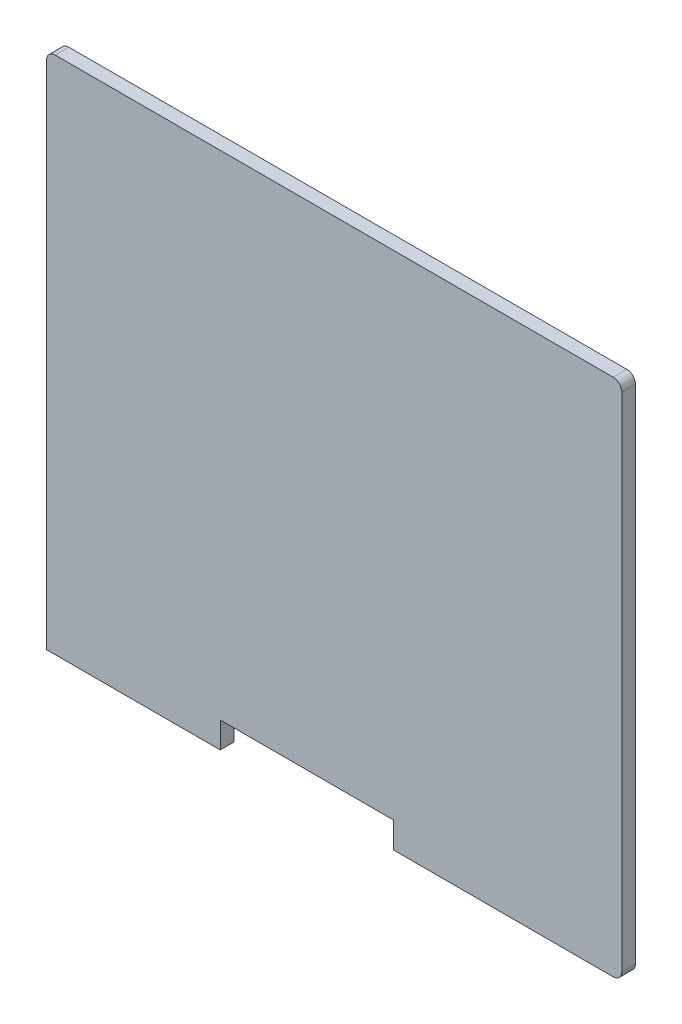
ISO-10303-21;
HEADER;
FILE_DESCRIPTION(('STEP AP214'),'2;1');
FILE_NAME('part.step','',(''),(''),'','','');
FILE_SCHEMA(('AUTOMOTIVE_DESIGN { 1 0 10303 214 1 1 1 1 }'));
ENDSEC;
DATA;
#1=APPLICATION_CONTEXT('core data for automotive mechanical design processes');
#2=APPLICATION_PROTOCOL_DEFINITION('international standard','automotive_design',2000,#1);
#3=PRODUCT_CONTEXT('',#1,'mechanical');
#4=PRODUCT('Part','Part','',(#3));
#5=PRODUCT_RELATED_PRODUCT_CATEGORY('part','',(#4));
#6=PRODUCT_DEFINITION_FORMATION('','',#4);
#7=PRODUCT_DEFINITION_CONTEXT('part definition',#1,'design');
#8=PRODUCT_DEFINITION('design','',#6,#7);
#9=PRODUCT_DEFINITION_SHAPE('','',#8);
#10=(LENGTH_UNIT() NAMED_UNIT(*) SI_UNIT(.MILLI.,.METRE.));
#11=(NAMED_UNIT(*) PLANE_ANGLE_UNIT() SI_UNIT($,.RADIAN.));
#12=(NAMED_UNIT(*) SI_UNIT($,.STERADIAN.) SOLID_ANGLE_UNIT());
#13=UNCERTAINTY_MEASURE_WITH_UNIT(LENGTH_MEASURE(1.E-05),#10,'distance_accuracy_value','');
#14=(GEOMETRIC_REPRESENTATION_CONTEXT(3) GLOBAL_UNCERTAINTY_ASSIGNED_CONTEXT((#13)) GLOBAL_UNIT_ASSIGNED_CONTEXT((#10,
#11,#12)) REPRESENTATION_CONTEXT('',''));
#15=CARTESIAN_POINT('',(0.,0.,0.));
#16=DIRECTION('',(0.,0.,1.));
#17=DIRECTION('',(1.,0.,0.));
#18=AXIS2_PLACEMENT_3D('',#15,#16,#17);
#19=CARTESIAN_POINT('',(55.5709843246072,7.31756397931187,-1.5748));
#20=DIRECTION('',(0.,-1.,0.));
#21=DIRECTION('',(1.,0.,0.));
#22=AXIS2_PLACEMENT_3D('',#19,#20,#21);
#23=PLANE('',#22);
#24=DIRECTION('',(1.,0.,0.));
#25=VECTOR('',#24,1.);
#26=CARTESIAN_POINT('',(55.5709843246072,7.31756397931187,0.));
#27=LINE('',#26,#25);
#28=CARTESIAN_POINT('',(55.5709843246072,7.31756397931187,0.));
#29=VERTEX_POINT('',#28);
#30=CARTESIAN_POINT('',(75.6429843246072,7.31756397931187,0.));
#31=VERTEX_POINT('',#30);
#32=EDGE_CURVE('E148',#29,#31,#27,.T.);
#33=ORIENTED_EDGE('',*,*,#32,.F.);
#34=DIRECTION('',(0.,0.,1.));
#35=VECTOR('',#34,1.);
#36=CARTESIAN_POINT('',(55.5709843246072,7.31756397931187,-1.5748));
#37=LINE('',#36,#35);
#38=CARTESIAN_POINT('',(55.5709843246072,7.31756397931187,-1.5748));
#39=VERTEX_POINT('',#38);
#40=EDGE_CURVE('E11',#39,#29,#37,.T.);
#41=ORIENTED_EDGE('',*,*,#40,.F.);
#42=DIRECTION('',(1.,0.,0.));
#43=VECTOR('',#42,1.);
#44=CARTESIAN_POINT('',(55.5709843246072,7.31756397931187,-1.5748));
#45=LINE('',#44,#43);
#46=CARTESIAN_POINT('',(75.6429843246072,7.31756397931187,-1.5748));
#47=VERTEX_POINT('',#46);
#48=EDGE_CURVE('E177',#39,#47,#45,.T.);
#49=ORIENTED_EDGE('',*,*,#48,.T.);
#50=DIRECTION('',(0.,0.,1.));
#51=VECTOR('',#50,1.);
#52=CARTESIAN_POINT('',(75.6429843246072,7.31756397931187,-1.5748));
#53=LINE('',#52,#51);
#54=EDGE_CURVE('E36',#47,#31,#53,.T.);
#55=ORIENTED_EDGE('',*,*,#54,.T.);
#56=EDGE_LOOP('',(#33,#41,#49,#55));
#57=FACE_BOUND('',#56,.T.);
#58=ADVANCED_FACE('F33',(#57),#23,.T.);
#59=CARTESIAN_POINT('',(55.5709843246072,66.3175639793119,-1.5748));
#60=DIRECTION('',(-1.,0.,0.));
#61=DIRECTION('',(0.,-1.,0.));
#62=AXIS2_PLACEMENT_3D('',#59,#60,#61);
#63=PLANE('',#62);
#64=DIRECTION('',(0.,-1.,0.));
#65=VECTOR('',#64,1.);
#66=CARTESIAN_POINT('',(55.5709843246072,66.3175639793119,0.));
#67=LINE('',#66,#65);
#68=CARTESIAN_POINT('',(55.5709843246072,66.3175639793119,0.));
#69=VERTEX_POINT('',#68);
#70=EDGE_CURVE('E175',#69,#29,#67,.T.);
#71=ORIENTED_EDGE('',*,*,#70,.F.);
#72=DIRECTION('',(0.,0.,1.));
#73=VECTOR('',#72,1.);
#74=CARTESIAN_POINT('',(55.5709843246072,66.3175639793119,-1.5748));
#75=LINE('',#74,#73);
#76=CARTESIAN_POINT('',(55.5709843246072,66.3175639793119,-1.5748));
#77=VERTEX_POINT('',#76);
#78=EDGE_CURVE('E42',#77,#69,#75,.T.);
#79=ORIENTED_EDGE('',*,*,#78,.F.);
#80=DIRECTION('',(0.,-1.,0.));
#81=VECTOR('',#80,1.);
#82=CARTESIAN_POINT('',(55.5709843246072,66.3175639793119,-1.5748));
#83=LINE('',#82,#81);
#84=EDGE_CURVE('E138',#77,#39,#83,.T.);
#85=ORIENTED_EDGE('',*,*,#84,.T.);
#86=ORIENTED_EDGE('',*,*,#40,.T.);
#87=EDGE_LOOP('',(#71,#79,#85,#86));
#88=FACE_BOUND('',#87,.T.);
#89=ADVANCED_FACE('F195',(#88),#63,.T.);
#90=CARTESIAN_POINT('',(56.5709843246072,66.3175639793119,-1.5748));
#91=DIRECTION('',(0.,0.,1.));
#92=DIRECTION('',(1.,0.,0.));
#93=AXIS2_PLACEMENT_3D('',#90,#91,#92);
#94=CYLINDRICAL_SURFACE('',#93,1.);
#95=CARTESIAN_POINT('',(56.5709843246072,66.3175639793119,0.));
#96=DIRECTION('',(0.,0.,1.));
#97=DIRECTION('',(1.,0.,0.));
#98=AXIS2_PLACEMENT_3D('',#95,#96,#97);
#99=CIRCLE('',#98,1.);
#100=CARTESIAN_POINT('',(56.5709843246072,67.3175639793119,0.));
#101=VERTEX_POINT('',#100);
#102=EDGE_CURVE('E125',#101,#69,#99,.T.);
#103=ORIENTED_EDGE('',*,*,#102,.F.);
#104=DIRECTION('',(0.,0.,1.));
#105=VECTOR('',#104,1.);
#106=CARTESIAN_POINT('',(56.5709843246072,67.3175639793119,-1.5748));
#107=LINE('',#106,#105);
#108=CARTESIAN_POINT('',(56.5709843246072,67.3175639793119,-1.5748));
#109=VERTEX_POINT('',#108);
#110=EDGE_CURVE('E120',#109,#101,#107,.T.);
#111=ORIENTED_EDGE('',*,*,#110,.F.);
#112=CARTESIAN_POINT('',(56.5709843246072,66.3175639793119,-1.5748));
#113=DIRECTION('',(0.,0.,1.));
#114=DIRECTION('',(1.,0.,0.));
#115=AXIS2_PLACEMENT_3D('',#112,#113,#114);
#116=CIRCLE('',#115,1.);
#117=EDGE_CURVE('E123',#109,#77,#116,.T.);
#118=ORIENTED_EDGE('',*,*,#117,.T.);
#119=ORIENTED_EDGE('',*,*,#78,.T.);
#120=EDGE_LOOP('',(#103,#111,#118,#119));
#121=FACE_BOUND('',#120,.T.);
#122=ADVANCED_FACE('F122',(#121),#94,.T.);
#123=CARTESIAN_POINT('',(56.5709843246072,67.3175639793119,-1.5748));
#124=DIRECTION('',(0.,1.,0.));
#125=DIRECTION('',(-1.,0.,0.));
#126=AXIS2_PLACEMENT_3D('',#123,#124,#125);
#127=PLANE('',#126);
#128=DIRECTION('',(-1.,0.,0.));
#129=VECTOR('',#128,1.);
#130=CARTESIAN_POINT('',(56.5709843246072,67.3175639793119,0.));
#131=LINE('',#130,#129);
#132=CARTESIAN_POINT('',(121.040984324607,67.3175639793119,0.));
#133=VERTEX_POINT('',#132);
#134=EDGE_CURVE('E172',#133,#101,#131,.T.);
#135=ORIENTED_EDGE('',*,*,#134,.F.);
#136=DIRECTION('',(0.,0.,1.));
#137=VECTOR('',#136,1.);
#138=CARTESIAN_POINT('',(121.040984324607,67.3175639793119,-1.5748));
#139=LINE('',#138,#137);
#140=CARTESIAN_POINT('',(121.040984324607,67.3175639793119,-1.5748));
#141=VERTEX_POINT('',#140);
#142=EDGE_CURVE('E130',#141,#133,#139,.T.);
#143=ORIENTED_EDGE('',*,*,#142,.F.);
#144=DIRECTION('',(-1.,0.,0.));
#145=VECTOR('',#144,1.);
#146=CARTESIAN_POINT('',(56.5709843246072,67.3175639793119,-1.5748));
#147=LINE('',#146,#145);
#148=EDGE_CURVE('E136',#141,#109,#147,.T.);
#149=ORIENTED_EDGE('',*,*,#148,.T.);
#150=ORIENTED_EDGE('',*,*,#110,.T.);
#151=EDGE_LOOP('',(#135,#143,#149,#150));
#152=FACE_BOUND('',#151,.T.);
#153=ADVANCED_FACE('F140',(#152),#127,.T.);
#154=CARTESIAN_POINT('',(121.040984324607,66.3175639793119,-1.5748));
#155=DIRECTION('',(0.,0.,1.));
#156=DIRECTION('',(1.,0.,0.));
#157=AXIS2_PLACEMENT_3D('',#154,#155,#156);
#158=CYLINDRICAL_SURFACE('',#157,1.);
#159=CARTESIAN_POINT('',(121.040984324607,66.3175639793119,0.));
#160=DIRECTION('',(0.,0.,1.));
#161=DIRECTION('',(-1.,0.,0.));
#162=AXIS2_PLACEMENT_3D('',#159,#160,#161);
#163=CIRCLE('',#162,1.);
#164=CARTESIAN_POINT('',(122.040984324607,66.3175639793119,0.));
#165=VERTEX_POINT('',#164);
#166=EDGE_CURVE('E169',#165,#133,#163,.T.);
#167=ORIENTED_EDGE('',*,*,#166,.F.);
#168=DIRECTION('',(0.,0.,1.));
#169=VECTOR('',#168,1.);
#170=CARTESIAN_POINT('',(122.040984324607,66.3175639793119,-1.5748));
#171=LINE('',#170,#169);
#172=CARTESIAN_POINT('',(122.040984324607,66.3175639793119,-1.5748));
#173=VERTEX_POINT('',#172);
#174=EDGE_CURVE('E181',#173,#165,#171,.T.);
#175=ORIENTED_EDGE('',*,*,#174,.F.);
#176=CARTESIAN_POINT('',(121.040984324607,66.3175639793119,-1.5748));
#177=DIRECTION('',(0.,0.,1.));
#178=DIRECTION('',(-1.,0.,0.));
#179=AXIS2_PLACEMENT_3D('',#176,#177,#178);
#180=CIRCLE('',#179,1.);
#181=EDGE_CURVE('E141',#173,#141,#180,.T.);
#182=ORIENTED_EDGE('',*,*,#181,.T.);
#183=ORIENTED_EDGE('',*,*,#142,.T.);
#184=EDGE_LOOP('',(#167,#175,#182,#183));
#185=FACE_BOUND('',#184,.T.);
#186=ADVANCED_FACE('F208',(#185),#158,.T.);
#187=CARTESIAN_POINT('',(122.040984324607,66.3175639793119,-1.5748));
#188=DIRECTION('',(1.,0.,0.));
#189=DIRECTION('',(0.,1.,0.));
#190=AXIS2_PLACEMENT_3D('',#187,#188,#189);
#191=PLANE('',#190);
#192=DIRECTION('',(0.,1.,0.));
#193=VECTOR('',#192,1.);
#194=CARTESIAN_POINT('',(122.040984324607,66.3175639793119,0.));
#195=LINE('',#194,#193);
#196=CARTESIAN_POINT('',(122.040984324607,8.31756397931187,0.));
#197=VERTEX_POINT('',#196);
#198=EDGE_CURVE('E166',#197,#165,#195,.T.);
#199=ORIENTED_EDGE('',*,*,#198,.F.);
#200=DIRECTION('',(0.,0.,1.));
#201=VECTOR('',#200,1.);
#202=CARTESIAN_POINT('',(122.040984324607,8.31756397931187,-1.5748));
#203=LINE('',#202,#201);
#204=CARTESIAN_POINT('',(122.040984324607,8.31756397931187,-1.5748));
#205=VERTEX_POINT('',#204);
#206=EDGE_CURVE('E183',#205,#197,#203,.T.);
#207=ORIENTED_EDGE('',*,*,#206,.F.);
#208=DIRECTION('',(0.,1.,0.));
#209=VECTOR('',#208,1.);
#210=CARTESIAN_POINT('',(122.040984324607,66.3175639793119,-1.5748));
#211=LINE('',#210,#209);
#212=EDGE_CURVE('E143',#205,#173,#211,.T.);
#213=ORIENTED_EDGE('',*,*,#212,.T.);
#214=ORIENTED_EDGE('',*,*,#174,.T.);
#215=EDGE_LOOP('',(#199,#207,#213,#214));
#216=FACE_BOUND('',#215,.T.);
#217=ADVANCED_FACE('F211',(#216),#191,.T.);
#218=CARTESIAN_POINT('',(121.040984324607,8.31756397931187,-1.5748));
#219=DIRECTION('',(0.,0.,1.));
#220=DIRECTION('',(1.,0.,0.));
#221=AXIS2_PLACEMENT_3D('',#218,#219,#220);
#222=CYLINDRICAL_SURFACE('',#221,1.00000000000001);
#223=CARTESIAN_POINT('',(121.040984324607,8.31756397931187,0.));
#224=DIRECTION('',(0.,0.,1.));
#225=DIRECTION('',(1.,0.,0.));
#226=AXIS2_PLACEMENT_3D('',#223,#224,#225);
#227=CIRCLE('',#226,1.00000000000001);
#228=CARTESIAN_POINT('',(121.040984324607,7.31756397931187,0.));
#229=VERTEX_POINT('',#228);
#230=EDGE_CURVE('E163',#229,#197,#227,.T.);
#231=ORIENTED_EDGE('',*,*,#230,.F.);
#232=DIRECTION('',(0.,0.,1.));
#233=VECTOR('',#232,1.);
#234=CARTESIAN_POINT('',(121.040984324607,7.31756397931187,-1.5748));
#235=LINE('',#234,#233);
#236=CARTESIAN_POINT('',(121.040984324607,7.31756397931187,-1.5748));
#237=VERTEX_POINT('',#236);
#238=EDGE_CURVE('E185',#237,#229,#235,.T.);
#239=ORIENTED_EDGE('',*,*,#238,.F.);
#240=CARTESIAN_POINT('',(121.040984324607,8.31756397931187,-1.5748));
#241=DIRECTION('',(0.,0.,1.));
#242=DIRECTION('',(1.,0.,0.));
#243=AXIS2_PLACEMENT_3D('',#240,#241,#242);
#244=CIRCLE('',#243,1.00000000000001);
#245=EDGE_CURVE('E327',#237,#205,#244,.T.);
#246=ORIENTED_EDGE('',*,*,#245,.T.);
#247=ORIENTED_EDGE('',*,*,#206,.T.);
#248=EDGE_LOOP('',(#231,#239,#246,#247));
#249=FACE_BOUND('',#248,.T.);
#250=ADVANCED_FACE('F215',(#249),#222,.T.);
#251=CARTESIAN_POINT('',(95.6429843246072,7.31756397931187,-1.5748));
#252=DIRECTION('',(0.,-1.,0.));
#253=DIRECTION('',(0.,0.,-1.));
#254=AXIS2_PLACEMENT_3D('',#251,#252,#253);
#255=PLANE('',#254);
#256=DIRECTION('',(1.,0.,0.));
#257=VECTOR('',#256,1.);
#258=CARTESIAN_POINT('',(95.6429843246072,7.31756397931187,0.));
#259=LINE('',#258,#257);
#260=CARTESIAN_POINT('',(95.6429843246072,7.31756397931187,0.));
#261=VERTEX_POINT('',#260);
#262=EDGE_CURVE('E160',#261,#229,#259,.T.);
#263=ORIENTED_EDGE('',*,*,#262,.F.);
#264=DIRECTION('',(0.,0.,1.));
#265=VECTOR('',#264,1.);
#266=CARTESIAN_POINT('',(95.6429843246072,7.31756397931187,-1.5748));
#267=LINE('',#266,#265);
#268=CARTESIAN_POINT('',(95.6429843246072,7.31756397931187,-1.5748));
#269=VERTEX_POINT('',#268);
#270=EDGE_CURVE('E187',#269,#261,#267,.T.);
#271=ORIENTED_EDGE('',*,*,#270,.F.);
#272=DIRECTION('',(1.,0.,0.));
#273=VECTOR('',#272,1.);
#274=CARTESIAN_POINT('',(95.6429843246072,7.31756397931187,-1.5748));
#275=LINE('',#274,#273);
#276=EDGE_CURVE('E320',#269,#237,#275,.T.);
#277=ORIENTED_EDGE('',*,*,#276,.T.);
#278=ORIENTED_EDGE('',*,*,#238,.T.);
#279=EDGE_LOOP('',(#263,#271,#277,#278));
#280=FACE_BOUND('',#279,.T.);
#281=ADVANCED_FACE('F219',(#280),#255,.T.);
#282=CARTESIAN_POINT('',(95.6429843246072,10.3175639793119,-1.5748));
#283=DIRECTION('',(-1.,0.,0.));
#284=DIRECTION('',(0.,0.,1.));
#285=AXIS2_PLACEMENT_3D('',#282,#283,#284);
#286=PLANE('',#285);
#287=DIRECTION('',(0.,-1.,0.));
#288=VECTOR('',#287,1.);
#289=CARTESIAN_POINT('',(95.6429843246072,10.3175639793119,0.));
#290=LINE('',#289,#288);
#291=CARTESIAN_POINT('',(95.6429843246072,10.3175639793119,0.));
#292=VERTEX_POINT('',#291);
#293=EDGE_CURVE('E157',#292,#261,#290,.T.);
#294=ORIENTED_EDGE('',*,*,#293,.F.);
#295=DIRECTION('',(0.,0.,1.));
#296=VECTOR('',#295,1.);
#297=CARTESIAN_POINT('',(95.6429843246072,10.3175639793119,-1.5748));
#298=LINE('',#297,#296);
#299=CARTESIAN_POINT('',(95.6429843246072,10.3175639793119,-1.5748));
#300=VERTEX_POINT('',#299);
#301=EDGE_CURVE('E189',#300,#292,#298,.T.);
#302=ORIENTED_EDGE('',*,*,#301,.F.);
#303=DIRECTION('',(0.,-1.,0.));
#304=VECTOR('',#303,1.);
#305=CARTESIAN_POINT('',(95.6429843246072,10.3175639793119,-1.5748));
#306=LINE('',#305,#304);
#307=EDGE_CURVE('E316',#300,#269,#306,.T.);
#308=ORIENTED_EDGE('',*,*,#307,.T.);
#309=ORIENTED_EDGE('',*,*,#270,.T.);
#310=EDGE_LOOP('',(#294,#302,#308,#309));
#311=FACE_BOUND('',#310,.T.);
#312=ADVANCED_FACE('F223',(#311),#286,.T.);
#313=CARTESIAN_POINT('',(75.6429843246072,10.3175639793119,-1.5748));
#314=DIRECTION('',(0.,-1.,0.));
#315=DIRECTION('',(0.,0.,-1.));
#316=AXIS2_PLACEMENT_3D('',#313,#314,#315);
#317=PLANE('',#316);
#318=DIRECTION('',(1.,0.,0.));
#319=VECTOR('',#318,1.);
#320=CARTESIAN_POINT('',(75.6429843246072,10.3175639793119,0.));
#321=LINE('',#320,#319);
#322=CARTESIAN_POINT('',(75.6429843246072,10.3175639793119,0.));
#323=VERTEX_POINT('',#322);
#324=EDGE_CURVE('E154',#323,#292,#321,.T.);
#325=ORIENTED_EDGE('',*,*,#324,.F.);
#326=DIRECTION('',(0.,0.,1.));
#327=VECTOR('',#326,1.);
#328=CARTESIAN_POINT('',(75.6429843246072,10.3175639793119,-1.5748));
#329=LINE('',#328,#327);
#330=CARTESIAN_POINT('',(75.6429843246072,10.3175639793119,-1.5748));
#331=VERTEX_POINT('',#330);
#332=EDGE_CURVE('E190',#331,#323,#329,.T.);
#333=ORIENTED_EDGE('',*,*,#332,.F.);
#334=DIRECTION('',(1.,0.,0.));
#335=VECTOR('',#334,1.);
#336=CARTESIAN_POINT('',(75.6429843246072,10.3175639793119,-1.5748));
#337=LINE('',#336,#335);
#338=EDGE_CURVE('E332',#331,#300,#337,.T.);
#339=ORIENTED_EDGE('',*,*,#338,.T.);
#340=ORIENTED_EDGE('',*,*,#301,.T.);
#341=EDGE_LOOP('',(#325,#333,#339,#340));
#342=FACE_BOUND('',#341,.T.);
#343=ADVANCED_FACE('F227',(#342),#317,.T.);
#344=CARTESIAN_POINT('',(75.6429843246072,7.31756397931187,-1.5748));
#345=DIRECTION('',(1.,0.,0.));
#346=DIRECTION('',(0.,0.,-1.));
#347=AXIS2_PLACEMENT_3D('',#344,#345,#346);
#348=PLANE('',#347);
#349=DIRECTION('',(0.,1.,0.));
#350=VECTOR('',#349,1.);
#351=CARTESIAN_POINT('',(75.6429843246072,7.31756397931187,0.));
#352=LINE('',#351,#350);
#353=EDGE_CURVE('E151',#31,#323,#352,.T.);
#354=ORIENTED_EDGE('',*,*,#353,.F.);
#355=ORIENTED_EDGE('',*,*,#54,.F.);
#356=DIRECTION('',(0.,1.,0.));
#357=VECTOR('',#356,1.);
#358=CARTESIAN_POINT('',(75.6429843246072,7.31756397931187,-1.5748));
#359=LINE('',#358,#357);
#360=EDGE_CURVE('E334',#47,#331,#359,.T.);
#361=ORIENTED_EDGE('',*,*,#360,.T.);
#362=ORIENTED_EDGE('',*,*,#332,.T.);
#363=EDGE_LOOP('',(#354,#355,#361,#362));
#364=FACE_BOUND('',#363,.T.);
#365=ADVANCED_FACE('F192',(#364),#348,.T.);
#366=CARTESIAN_POINT('',(121.040984324607,8.31756397931187,-1.5748));
#367=DIRECTION('',(0.,0.,1.));
#368=DIRECTION('',(1.,0.,0.));
#369=AXIS2_PLACEMENT_3D('',#366,#367,#368);
#370=PLANE('',#369);
#371=ORIENTED_EDGE('',*,*,#48,.F.);
#372=ORIENTED_EDGE('',*,*,#84,.F.);
#373=ORIENTED_EDGE('',*,*,#117,.F.);
#374=ORIENTED_EDGE('',*,*,#148,.F.);
#375=ORIENTED_EDGE('',*,*,#181,.F.);
#376=ORIENTED_EDGE('',*,*,#212,.F.);
#377=ORIENTED_EDGE('',*,*,#245,.F.);
#378=ORIENTED_EDGE('',*,*,#276,.F.);
#379=ORIENTED_EDGE('',*,*,#307,.F.);
#380=ORIENTED_EDGE('',*,*,#338,.F.);
#381=ORIENTED_EDGE('',*,*,#360,.F.);
#382=EDGE_LOOP('',(#371,#372,#373,#374,#375,#376,#377,#378,#379,#380,#381));
#383=FACE_BOUND('',#382,.T.);
#384=ADVANCED_FACE('F134',(#383),#370,.F.);
#385=CARTESIAN_POINT('',(121.040984324607,8.31756397931187,0.));
#386=DIRECTION('',(0.,0.,1.));
#387=DIRECTION('',(1.,0.,0.));
#388=AXIS2_PLACEMENT_3D('',#385,#386,#387);
#389=PLANE('',#388);
#390=ORIENTED_EDGE('',*,*,#32,.T.);
#391=ORIENTED_EDGE('',*,*,#353,.T.);
#392=ORIENTED_EDGE('',*,*,#324,.T.);
#393=ORIENTED_EDGE('',*,*,#293,.T.);
#394=ORIENTED_EDGE('',*,*,#262,.T.);
#395=ORIENTED_EDGE('',*,*,#230,.T.);
#396=ORIENTED_EDGE('',*,*,#198,.T.);
#397=ORIENTED_EDGE('',*,*,#166,.T.);
#398=ORIENTED_EDGE('',*,*,#134,.T.);
#399=ORIENTED_EDGE('',*,*,#102,.T.);
#400=ORIENTED_EDGE('',*,*,#70,.T.);
#401=EDGE_LOOP('',(#390,#391,#392,#393,#394,#395,#396,#397,#398,#399,#400));
#402=FACE_BOUND('',#401,.T.);
#403=ADVANCED_FACE('F194',(#402),#389,.T.);
#404=CLOSED_SHELL('',(#58,#89,#122,#153,#186,#217,#250,#281,#312,#343,#365,#384,#403));
#405=MANIFOLD_SOLID_BREP('B2',#404);
#406=ADVANCED_BREP_SHAPE_REPRESENTATION('',(#18,#405),#14);
#407=SHAPE_DEFINITION_REPRESENTATION(#9,#406);
ENDSEC;
END-ISO-10303-21;
